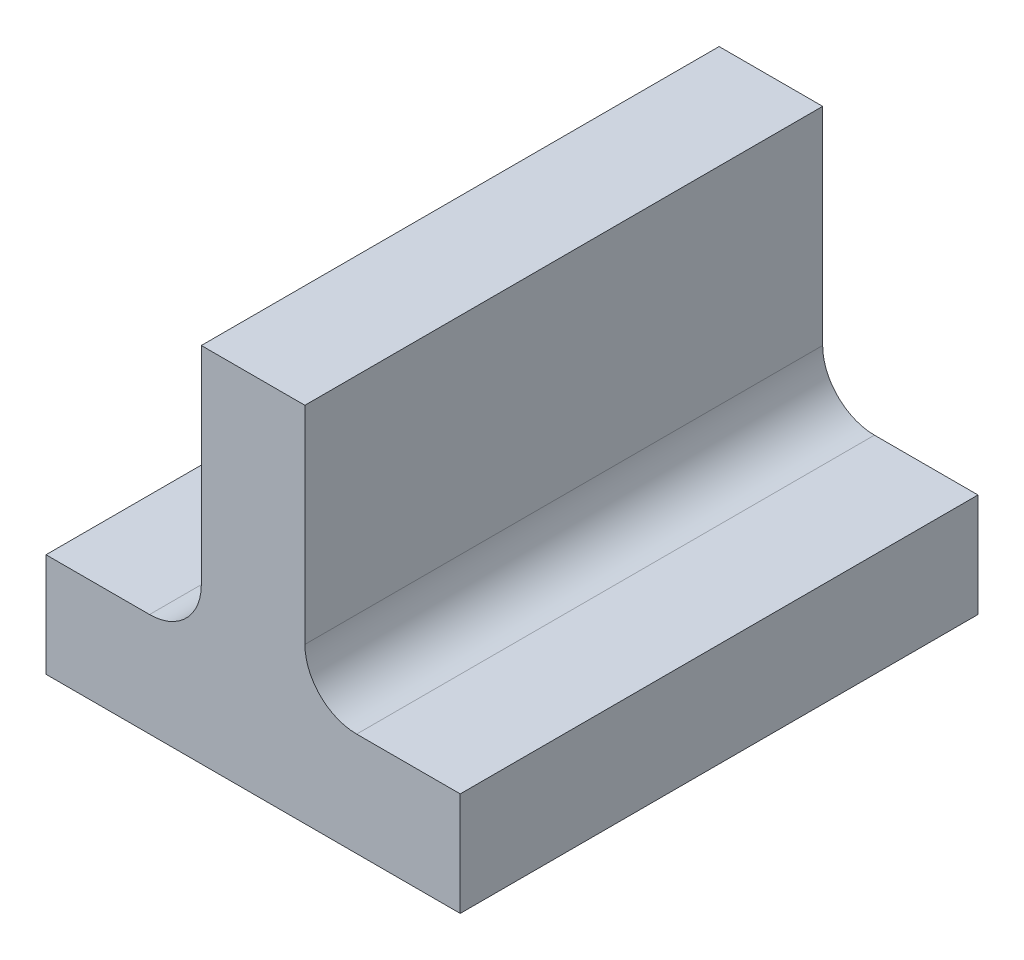
ISO-10303-21;
HEADER;
FILE_DESCRIPTION(('STEP AP214'),'2;1');
FILE_NAME('part.step','',(''),(''),'','','');
FILE_SCHEMA(('AUTOMOTIVE_DESIGN { 1 0 10303 214 1 1 1 1 }'));
ENDSEC;
DATA;
#1=APPLICATION_CONTEXT('core data for automotive mechanical design processes');
#2=APPLICATION_PROTOCOL_DEFINITION('international standard','automotive_design',2000,#1);
#3=PRODUCT_CONTEXT('',#1,'mechanical');
#4=PRODUCT('Part','Part','',(#3));
#5=PRODUCT_RELATED_PRODUCT_CATEGORY('part','',(#4));
#6=PRODUCT_DEFINITION_FORMATION('','',#4);
#7=PRODUCT_DEFINITION_CONTEXT('part definition',#1,'design');
#8=PRODUCT_DEFINITION('design','',#6,#7);
#9=PRODUCT_DEFINITION_SHAPE('','',#8);
#10=(LENGTH_UNIT() NAMED_UNIT(*) SI_UNIT(.MILLI.,.METRE.));
#11=(NAMED_UNIT(*) PLANE_ANGLE_UNIT() SI_UNIT($,.RADIAN.));
#12=(NAMED_UNIT(*) SI_UNIT($,.STERADIAN.) SOLID_ANGLE_UNIT());
#13=UNCERTAINTY_MEASURE_WITH_UNIT(LENGTH_MEASURE(1.E-05),#10,'distance_accuracy_value','');
#14=(GEOMETRIC_REPRESENTATION_CONTEXT(3) GLOBAL_UNCERTAINTY_ASSIGNED_CONTEXT((#13)) GLOBAL_UNIT_ASSIGNED_CONTEXT((#10,
#11,#12)) REPRESENTATION_CONTEXT('',''));
#15=CARTESIAN_POINT('',(0.,0.,0.));
#16=DIRECTION('',(0.,0.,1.));
#17=DIRECTION('',(1.,0.,0.));
#18=AXIS2_PLACEMENT_3D('',#15,#16,#17);
#19=CARTESIAN_POINT('',(-8.,4.,20.));
#20=DIRECTION('',(1.,0.,0.));
#21=DIRECTION('',(0.,1.,0.));
#22=AXIS2_PLACEMENT_3D('',#19,#20,#21);
#23=PLANE('',#22);
#24=DIRECTION('',(0.,-1.,0.));
#25=VECTOR('',#24,1.);
#26=CARTESIAN_POINT('',(-8.,4.,0.));
#27=LINE('',#26,#25);
#28=CARTESIAN_POINT('',(-8.,4.,0.));
#29=VERTEX_POINT('',#28);
#30=CARTESIAN_POINT('',(-8.,0.,0.));
#31=VERTEX_POINT('',#30);
#32=EDGE_CURVE('E131',#29,#31,#27,.T.);
#33=ORIENTED_EDGE('',*,*,#32,.T.);
#34=DIRECTION('',(0.,0.,-1.));
#35=VECTOR('',#34,1.);
#36=CARTESIAN_POINT('',(-8.,0.,20.));
#37=LINE('',#36,#35);
#38=CARTESIAN_POINT('',(-8.,0.,20.));
#39=VERTEX_POINT('',#38);
#40=EDGE_CURVE('E112',#39,#31,#37,.T.);
#41=ORIENTED_EDGE('',*,*,#40,.F.);
#42=DIRECTION('',(0.,-1.,0.));
#43=VECTOR('',#42,1.);
#44=CARTESIAN_POINT('',(-8.,4.,20.));
#45=LINE('',#44,#43);
#46=CARTESIAN_POINT('',(-8.,4.,20.));
#47=VERTEX_POINT('',#46);
#48=EDGE_CURVE('E119',#47,#39,#45,.T.);
#49=ORIENTED_EDGE('',*,*,#48,.F.);
#50=DIRECTION('',(0.,0.,-1.));
#51=VECTOR('',#50,1.);
#52=CARTESIAN_POINT('',(-8.,4.,20.));
#53=LINE('',#52,#51);
#54=EDGE_CURVE('E191',#47,#29,#53,.T.);
#55=ORIENTED_EDGE('',*,*,#54,.T.);
#56=EDGE_LOOP('',(#33,#41,#49,#55));
#57=FACE_BOUND('',#56,.T.);
#58=ADVANCED_FACE('F31',(#57),#23,.F.);
#59=CARTESIAN_POINT('',(-8.,0.,20.));
#60=DIRECTION('',(0.,1.,0.));
#61=DIRECTION('',(-1.,0.,0.));
#62=AXIS2_PLACEMENT_3D('',#59,#60,#61);
#63=PLANE('',#62);
#64=DIRECTION('',(1.,0.,0.));
#65=VECTOR('',#64,1.);
#66=CARTESIAN_POINT('',(-8.,0.,0.));
#67=LINE('',#66,#65);
#68=CARTESIAN_POINT('',(8.00000000000001,0.,0.));
#69=VERTEX_POINT('',#68);
#70=EDGE_CURVE('E183',#31,#69,#67,.T.);
#71=ORIENTED_EDGE('',*,*,#70,.T.);
#72=DIRECTION('',(0.,0.,-1.));
#73=VECTOR('',#72,1.);
#74=CARTESIAN_POINT('',(8.00000000000001,0.,20.));
#75=LINE('',#74,#73);
#76=CARTESIAN_POINT('',(8.00000000000001,0.,20.));
#77=VERTEX_POINT('',#76);
#78=EDGE_CURVE('E115',#77,#69,#75,.T.);
#79=ORIENTED_EDGE('',*,*,#78,.F.);
#80=DIRECTION('',(1.,0.,0.));
#81=VECTOR('',#80,1.);
#82=CARTESIAN_POINT('',(-8.,0.,20.));
#83=LINE('',#82,#81);
#84=EDGE_CURVE('E108',#39,#77,#83,.T.);
#85=ORIENTED_EDGE('',*,*,#84,.F.);
#86=ORIENTED_EDGE('',*,*,#40,.T.);
#87=EDGE_LOOP('',(#71,#79,#85,#86));
#88=FACE_BOUND('',#87,.T.);
#89=ADVANCED_FACE('F110',(#88),#63,.F.);
#90=CARTESIAN_POINT('',(8.00000000000001,0.,20.));
#91=DIRECTION('',(-1.,0.,0.));
#92=DIRECTION('',(0.,-1.,0.));
#93=AXIS2_PLACEMENT_3D('',#90,#91,#92);
#94=PLANE('',#93);
#95=DIRECTION('',(0.,1.,0.));
#96=VECTOR('',#95,1.);
#97=CARTESIAN_POINT('',(8.00000000000001,0.,0.));
#98=LINE('',#97,#96);
#99=CARTESIAN_POINT('',(8.,4.,0.));
#100=VERTEX_POINT('',#99);
#101=EDGE_CURVE('E179',#69,#100,#98,.T.);
#102=ORIENTED_EDGE('',*,*,#101,.T.);
#103=DIRECTION('',(0.,0.,-1.));
#104=VECTOR('',#103,1.);
#105=CARTESIAN_POINT('',(8.,4.,20.));
#106=LINE('',#105,#104);
#107=CARTESIAN_POINT('',(8.,4.,20.));
#108=VERTEX_POINT('',#107);
#109=EDGE_CURVE('E137',#108,#100,#106,.T.);
#110=ORIENTED_EDGE('',*,*,#109,.F.);
#111=DIRECTION('',(0.,1.,0.));
#112=VECTOR('',#111,1.);
#113=CARTESIAN_POINT('',(8.00000000000001,0.,20.));
#114=LINE('',#113,#112);
#115=EDGE_CURVE('E118',#77,#108,#114,.T.);
#116=ORIENTED_EDGE('',*,*,#115,.F.);
#117=ORIENTED_EDGE('',*,*,#78,.T.);
#118=EDGE_LOOP('',(#102,#110,#116,#117));
#119=FACE_BOUND('',#118,.T.);
#120=ADVANCED_FACE('F211',(#119),#94,.F.);
#121=CARTESIAN_POINT('',(8.,4.,20.));
#122=DIRECTION('',(0.,-1.,0.));
#123=DIRECTION('',(1.,0.,0.));
#124=AXIS2_PLACEMENT_3D('',#121,#122,#123);
#125=PLANE('',#124);
#126=DIRECTION('',(-1.,0.,0.));
#127=VECTOR('',#126,1.);
#128=CARTESIAN_POINT('',(8.,4.,0.));
#129=LINE('',#128,#127);
#130=CARTESIAN_POINT('',(4.,4.,0.));
#131=VERTEX_POINT('',#130);
#132=EDGE_CURVE('E172',#100,#131,#129,.T.);
#133=ORIENTED_EDGE('',*,*,#132,.T.);
#134=DIRECTION('',(0.,0.,-1.));
#135=VECTOR('',#134,1.);
#136=CARTESIAN_POINT('',(4.,4.,20.));
#137=LINE('',#136,#135);
#138=CARTESIAN_POINT('',(4.,4.,20.));
#139=VERTEX_POINT('',#138);
#140=EDGE_CURVE('E135',#131,#139,#137,.F.);
#141=ORIENTED_EDGE('',*,*,#140,.T.);
#142=DIRECTION('',(-1.,0.,0.));
#143=VECTOR('',#142,1.);
#144=CARTESIAN_POINT('',(8.,4.,20.));
#145=LINE('',#144,#143);
#146=EDGE_CURVE('E155',#108,#139,#145,.T.);
#147=ORIENTED_EDGE('',*,*,#146,.F.);
#148=ORIENTED_EDGE('',*,*,#109,.T.);
#149=EDGE_LOOP('',(#133,#141,#147,#148));
#150=FACE_BOUND('',#149,.T.);
#151=ADVANCED_FACE('F177',(#150),#125,.F.);
#152=CARTESIAN_POINT('',(2.,4.,20.));
#153=DIRECTION('',(-1.,0.,0.));
#154=DIRECTION('',(0.,-1.,0.));
#155=AXIS2_PLACEMENT_3D('',#152,#153,#154);
#156=PLANE('',#155);
#157=DIRECTION('',(0.,1.,0.));
#158=VECTOR('',#157,1.);
#159=CARTESIAN_POINT('',(2.,4.,20.));
#160=LINE('',#159,#158);
#161=CARTESIAN_POINT('',(2.,6.,20.));
#162=VERTEX_POINT('',#161);
#163=CARTESIAN_POINT('',(2.,14.,20.));
#164=VERTEX_POINT('',#163);
#165=EDGE_CURVE('E152',#162,#164,#160,.T.);
#166=ORIENTED_EDGE('',*,*,#165,.F.);
#167=DIRECTION('',(0.,0.,-1.));
#168=VECTOR('',#167,1.);
#169=CARTESIAN_POINT('',(2.,6.,0.));
#170=LINE('',#169,#168);
#171=CARTESIAN_POINT('',(2.,6.,0.));
#172=VERTEX_POINT('',#171);
#173=EDGE_CURVE('E132',#162,#172,#170,.T.);
#174=ORIENTED_EDGE('',*,*,#173,.T.);
#175=DIRECTION('',(0.,1.,0.));
#176=VECTOR('',#175,1.);
#177=CARTESIAN_POINT('',(2.,4.,0.));
#178=LINE('',#177,#176);
#179=CARTESIAN_POINT('',(2.,14.,0.));
#180=VERTEX_POINT('',#179);
#181=EDGE_CURVE('E174',#172,#180,#178,.T.);
#182=ORIENTED_EDGE('',*,*,#181,.T.);
#183=DIRECTION('',(0.,0.,-1.));
#184=VECTOR('',#183,1.);
#185=CARTESIAN_POINT('',(2.,14.,20.));
#186=LINE('',#185,#184);
#187=EDGE_CURVE('E163',#164,#180,#186,.T.);
#188=ORIENTED_EDGE('',*,*,#187,.F.);
#189=EDGE_LOOP('',(#166,#174,#182,#188));
#190=FACE_BOUND('',#189,.T.);
#191=ADVANCED_FACE('F160',(#190),#156,.F.);
#192=CARTESIAN_POINT('',(2.,14.,20.));
#193=DIRECTION('',(0.,-1.,0.));
#194=DIRECTION('',(1.,0.,0.));
#195=AXIS2_PLACEMENT_3D('',#192,#193,#194);
#196=PLANE('',#195);
#197=DIRECTION('',(-1.,0.,0.));
#198=VECTOR('',#197,1.);
#199=CARTESIAN_POINT('',(2.,14.,0.));
#200=LINE('',#199,#198);
#201=CARTESIAN_POINT('',(-2.,14.,0.));
#202=VERTEX_POINT('',#201);
#203=EDGE_CURVE('E181',#180,#202,#200,.T.);
#204=ORIENTED_EDGE('',*,*,#203,.T.);
#205=DIRECTION('',(0.,0.,-1.));
#206=VECTOR('',#205,1.);
#207=CARTESIAN_POINT('',(-2.,14.,20.));
#208=LINE('',#207,#206);
#209=CARTESIAN_POINT('',(-2.,14.,20.));
#210=VERTEX_POINT('',#209);
#211=EDGE_CURVE('E193',#210,#202,#208,.T.);
#212=ORIENTED_EDGE('',*,*,#211,.F.);
#213=DIRECTION('',(-1.,0.,0.));
#214=VECTOR('',#213,1.);
#215=CARTESIAN_POINT('',(2.,14.,20.));
#216=LINE('',#215,#214);
#217=EDGE_CURVE('E165',#164,#210,#216,.T.);
#218=ORIENTED_EDGE('',*,*,#217,.F.);
#219=ORIENTED_EDGE('',*,*,#187,.T.);
#220=EDGE_LOOP('',(#204,#212,#218,#219));
#221=FACE_BOUND('',#220,.T.);
#222=ADVANCED_FACE('F197',(#221),#196,.F.);
#223=CARTESIAN_POINT('',(-2.,14.,20.));
#224=DIRECTION('',(1.,0.,0.));
#225=DIRECTION('',(0.,1.,0.));
#226=AXIS2_PLACEMENT_3D('',#223,#224,#225);
#227=PLANE('',#226);
#228=DIRECTION('',(0.,-1.,0.));
#229=VECTOR('',#228,1.);
#230=CARTESIAN_POINT('',(-2.,14.,0.));
#231=LINE('',#230,#229);
#232=CARTESIAN_POINT('',(-2.,6.,0.));
#233=VERTEX_POINT('',#232);
#234=EDGE_CURVE('E188',#202,#233,#231,.T.);
#235=ORIENTED_EDGE('',*,*,#234,.T.);
#236=DIRECTION('',(0.,0.,-1.));
#237=VECTOR('',#236,1.);
#238=CARTESIAN_POINT('',(-2.,6.,20.));
#239=LINE('',#238,#237);
#240=CARTESIAN_POINT('',(-2.,6.,20.));
#241=VERTEX_POINT('',#240);
#242=EDGE_CURVE('E46',#233,#241,#239,.F.);
#243=ORIENTED_EDGE('',*,*,#242,.T.);
#244=DIRECTION('',(0.,-1.,0.));
#245=VECTOR('',#244,1.);
#246=CARTESIAN_POINT('',(-2.,14.,20.));
#247=LINE('',#246,#245);
#248=EDGE_CURVE('E203',#210,#241,#247,.T.);
#249=ORIENTED_EDGE('',*,*,#248,.F.);
#250=ORIENTED_EDGE('',*,*,#211,.T.);
#251=EDGE_LOOP('',(#235,#243,#249,#250));
#252=FACE_BOUND('',#251,.T.);
#253=ADVANCED_FACE('F199',(#252),#227,.F.);
#254=CARTESIAN_POINT('',(-2.,4.,20.));
#255=DIRECTION('',(0.,-1.,0.));
#256=DIRECTION('',(1.,0.,0.));
#257=AXIS2_PLACEMENT_3D('',#254,#255,#256);
#258=PLANE('',#257);
#259=DIRECTION('',(-1.,0.,0.));
#260=VECTOR('',#259,1.);
#261=CARTESIAN_POINT('',(-2.,4.,20.));
#262=LINE('',#261,#260);
#263=CARTESIAN_POINT('',(-4.,4.,20.));
#264=VERTEX_POINT('',#263);
#265=EDGE_CURVE('E124',#264,#47,#262,.T.);
#266=ORIENTED_EDGE('',*,*,#265,.F.);
#267=DIRECTION('',(0.,0.,-1.));
#268=VECTOR('',#267,1.);
#269=CARTESIAN_POINT('',(-4.,4.,0.));
#270=LINE('',#269,#268);
#271=CARTESIAN_POINT('',(-4.,4.,0.));
#272=VERTEX_POINT('',#271);
#273=EDGE_CURVE('E142',#264,#272,#270,.T.);
#274=ORIENTED_EDGE('',*,*,#273,.T.);
#275=DIRECTION('',(-1.,0.,0.));
#276=VECTOR('',#275,1.);
#277=CARTESIAN_POINT('',(-2.,4.,0.));
#278=LINE('',#277,#276);
#279=EDGE_CURVE('E128',#272,#29,#278,.T.);
#280=ORIENTED_EDGE('',*,*,#279,.T.);
#281=ORIENTED_EDGE('',*,*,#54,.F.);
#282=EDGE_LOOP('',(#266,#274,#280,#281));
#283=FACE_BOUND('',#282,.T.);
#284=ADVANCED_FACE('F205',(#283),#258,.F.);
#285=CARTESIAN_POINT('',(-8.,0.,20.));
#286=DIRECTION('',(0.,0.,1.));
#287=DIRECTION('',(1.,0.,0.));
#288=AXIS2_PLACEMENT_3D('',#285,#286,#287);
#289=PLANE('',#288);
#290=ORIENTED_EDGE('',*,*,#48,.T.);
#291=ORIENTED_EDGE('',*,*,#84,.T.);
#292=ORIENTED_EDGE('',*,*,#115,.T.);
#293=ORIENTED_EDGE('',*,*,#146,.T.);
#294=CARTESIAN_POINT('',(4.,6.,20.));
#295=DIRECTION('',(0.,0.,1.));
#296=DIRECTION('',(1.,0.,0.));
#297=AXIS2_PLACEMENT_3D('',#294,#295,#296);
#298=CIRCLE('',#297,2.);
#299=EDGE_CURVE('E148',#139,#162,#298,.F.);
#300=ORIENTED_EDGE('',*,*,#299,.T.);
#301=ORIENTED_EDGE('',*,*,#165,.T.);
#302=ORIENTED_EDGE('',*,*,#217,.T.);
#303=ORIENTED_EDGE('',*,*,#248,.T.);
#304=CARTESIAN_POINT('',(-4.,6.,20.));
#305=DIRECTION('',(0.,0.,1.));
#306=DIRECTION('',(1.,0.,0.));
#307=AXIS2_PLACEMENT_3D('',#304,#305,#306);
#308=CIRCLE('',#307,2.);
#309=EDGE_CURVE('E11',#241,#264,#308,.F.);
#310=ORIENTED_EDGE('',*,*,#309,.T.);
#311=ORIENTED_EDGE('',*,*,#265,.T.);
#312=EDGE_LOOP('',(#290,#291,#292,#293,#300,#301,#302,#303,#310,#311));
#313=FACE_BOUND('',#312,.T.);
#314=ADVANCED_FACE('F122',(#313),#289,.T.);
#315=CARTESIAN_POINT('',(-8.,0.,0.));
#316=DIRECTION('',(0.,0.,1.));
#317=DIRECTION('',(1.,0.,0.));
#318=AXIS2_PLACEMENT_3D('',#315,#316,#317);
#319=PLANE('',#318);
#320=ORIENTED_EDGE('',*,*,#32,.F.);
#321=ORIENTED_EDGE('',*,*,#279,.F.);
#322=CARTESIAN_POINT('',(-4.,6.,0.));
#323=DIRECTION('',(0.,0.,1.));
#324=DIRECTION('',(1.,0.,0.));
#325=AXIS2_PLACEMENT_3D('',#322,#323,#324);
#326=CIRCLE('',#325,2.);
#327=EDGE_CURVE('E39',#272,#233,#326,.T.);
#328=ORIENTED_EDGE('',*,*,#327,.T.);
#329=ORIENTED_EDGE('',*,*,#234,.F.);
#330=ORIENTED_EDGE('',*,*,#203,.F.);
#331=ORIENTED_EDGE('',*,*,#181,.F.);
#332=CARTESIAN_POINT('',(4.,6.,0.));
#333=DIRECTION('',(0.,0.,1.));
#334=DIRECTION('',(1.,0.,0.));
#335=AXIS2_PLACEMENT_3D('',#332,#333,#334);
#336=CIRCLE('',#335,2.);
#337=EDGE_CURVE('E146',#172,#131,#336,.T.);
#338=ORIENTED_EDGE('',*,*,#337,.T.);
#339=ORIENTED_EDGE('',*,*,#132,.F.);
#340=ORIENTED_EDGE('',*,*,#101,.F.);
#341=ORIENTED_EDGE('',*,*,#70,.F.);
#342=EDGE_LOOP('',(#320,#321,#328,#329,#330,#331,#338,#339,#340,#341));
#343=FACE_BOUND('',#342,.T.);
#344=ADVANCED_FACE('F170',(#343),#319,.F.);
#345=CARTESIAN_POINT('',(4.,6.,20.));
#346=DIRECTION('',(0.,0.,1.));
#347=DIRECTION('',(1.,0.,0.));
#348=AXIS2_PLACEMENT_3D('',#345,#346,#347);
#349=CYLINDRICAL_SURFACE('',#348,2.);
#350=ORIENTED_EDGE('',*,*,#299,.F.);
#351=ORIENTED_EDGE('',*,*,#140,.F.);
#352=ORIENTED_EDGE('',*,*,#337,.F.);
#353=ORIENTED_EDGE('',*,*,#173,.F.);
#354=EDGE_LOOP('',(#350,#351,#352,#353));
#355=FACE_BOUND('',#354,.T.);
#356=ADVANCED_FACE('F167',(#355),#349,.F.);
#357=CARTESIAN_POINT('',(-4.,6.,20.));
#358=DIRECTION('',(0.,0.,1.));
#359=DIRECTION('',(1.,0.,0.));
#360=AXIS2_PLACEMENT_3D('',#357,#358,#359);
#361=CYLINDRICAL_SURFACE('',#360,2.);
#362=ORIENTED_EDGE('',*,*,#309,.F.);
#363=ORIENTED_EDGE('',*,*,#242,.F.);
#364=ORIENTED_EDGE('',*,*,#327,.F.);
#365=ORIENTED_EDGE('',*,*,#273,.F.);
#366=EDGE_LOOP('',(#362,#363,#364,#365));
#367=FACE_BOUND('',#366,.T.);
#368=ADVANCED_FACE('F33',(#367),#361,.F.);
#369=CLOSED_SHELL('',(#58,#89,#120,#151,#191,#222,#253,#284,#314,#344,#356,#368));
#370=MANIFOLD_SOLID_BREP('B2',#369);
#371=ADVANCED_BREP_SHAPE_REPRESENTATION('',(#18,#370),#14);
#372=SHAPE_DEFINITION_REPRESENTATION(#9,#371);
ENDSEC;
END-ISO-10303-21;
